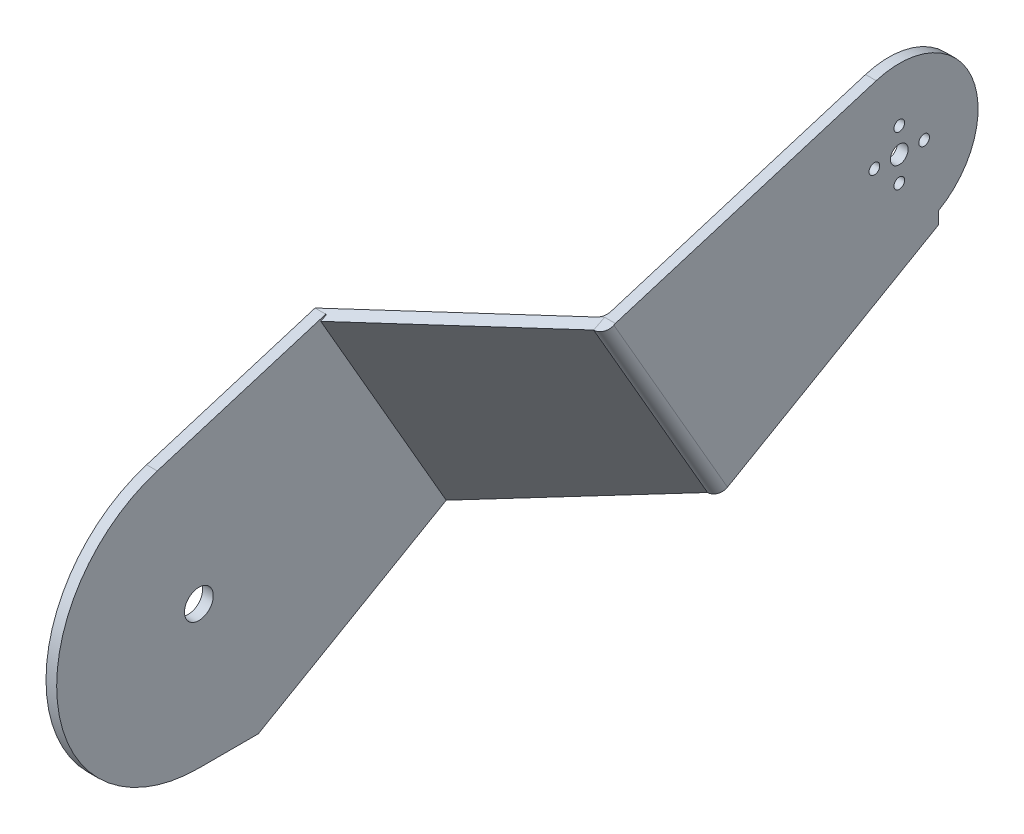
ISO-10303-21;
HEADER;
FILE_DESCRIPTION(('STEP AP214'),'2;1');
FILE_NAME('part.step','',(''),(''),'','','');
FILE_SCHEMA(('AUTOMOTIVE_DESIGN { 1 0 10303 214 1 1 1 1 }'));
ENDSEC;
DATA;
#1=APPLICATION_CONTEXT('core data for automotive mechanical design processes');
#2=APPLICATION_PROTOCOL_DEFINITION('international standard','automotive_design',2000,#1);
#3=PRODUCT_CONTEXT('',#1,'mechanical');
#4=PRODUCT('Part','Part','',(#3));
#5=PRODUCT_RELATED_PRODUCT_CATEGORY('part','',(#4));
#6=PRODUCT_DEFINITION_FORMATION('','',#4);
#7=PRODUCT_DEFINITION_CONTEXT('part definition',#1,'design');
#8=PRODUCT_DEFINITION('design','',#6,#7);
#9=PRODUCT_DEFINITION_SHAPE('','',#8);
#10=(LENGTH_UNIT() NAMED_UNIT(*) SI_UNIT(.MILLI.,.METRE.));
#11=(NAMED_UNIT(*) PLANE_ANGLE_UNIT() SI_UNIT($,.RADIAN.));
#12=(NAMED_UNIT(*) SI_UNIT($,.STERADIAN.) SOLID_ANGLE_UNIT());
#13=UNCERTAINTY_MEASURE_WITH_UNIT(LENGTH_MEASURE(1.E-05),#10,'distance_accuracy_value','');
#14=(GEOMETRIC_REPRESENTATION_CONTEXT(3) GLOBAL_UNCERTAINTY_ASSIGNED_CONTEXT((#13)) GLOBAL_UNIT_ASSIGNED_CONTEXT((#10,
#11,#12)) REPRESENTATION_CONTEXT('',''));
#15=CARTESIAN_POINT('',(0.,0.,0.));
#16=DIRECTION('',(0.,0.,1.));
#17=DIRECTION('',(1.,0.,0.));
#18=AXIS2_PLACEMENT_3D('',#15,#16,#17);
#19=CARTESIAN_POINT('',(-52.001,61.7550857669214,-65.1381957355268));
#20=DIRECTION('',(0.,-0.893612931495519,-0.448838421555002));
#21=DIRECTION('',(0.,0.448838421555002,-0.893612931495519));
#22=AXIS2_PLACEMENT_3D('',#19,#20,#21);
#23=PLANE('',#22);
#24=DIRECTION('',(0.,0.448838421555002,-0.893612931495518));
#25=VECTOR('',#24,1.);
#26=CARTESIAN_POINT('',(0.,23.1880208405675,11.6467368658676));
#27=LINE('',#26,#25);
#28=CARTESIAN_POINT('',(0.,60.1976964158819,-62.0375180826629));
#29=VERTEX_POINT('',#28);
#30=CARTESIAN_POINT('',(0.,61.7550857669214,-65.1381957355268));
#31=VERTEX_POINT('',#30);
#32=EDGE_CURVE('E180',#29,#31,#27,.T.);
#33=ORIENTED_EDGE('',*,*,#32,.F.);
#34=CARTESIAN_POINT('',(0.,61.5464351574655,-64.7227836989898));
#35=DIRECTION('',(0.,-0.893612931495519,-0.448838421555002));
#36=DIRECTION('',(0.,0.448838421555002,-0.893612931495519));
#37=AXIS2_PLACEMENT_3D('',#34,#35,#36);
#38=ELLIPSE('',#37,3.00495384711238,3.);
#39=CARTESIAN_POINT('',(3.,61.5464351574655,-64.7227836989898));
#40=VERTEX_POINT('',#39);
#41=EDGE_CURVE('E282',#29,#40,#38,.F.);
#42=ORIENTED_EDGE('',*,*,#41,.T.);
#43=DIRECTION('',(0.,0.448838421555002,-0.893612931495519));
#44=VECTOR('',#43,1.);
#45=CARTESIAN_POINT('',(3.,61.7550857669214,-65.1381957355268));
#46=LINE('',#45,#44);
#47=CARTESIAN_POINT('',(3.,61.7550857669214,-65.1381957355268));
#48=VERTEX_POINT('',#47);
#49=EDGE_CURVE('E175',#40,#48,#46,.T.);
#50=ORIENTED_EDGE('',*,*,#49,.T.);
#51=DIRECTION('',(1.,0.,0.));
#52=VECTOR('',#51,1.);
#53=CARTESIAN_POINT('',(-52.001,61.7550857669214,-65.1381957355268));
#54=LINE('',#53,#52);
#55=EDGE_CURVE('E177',#31,#48,#54,.T.);
#56=ORIENTED_EDGE('',*,*,#55,.F.);
#57=EDGE_LOOP('',(#33,#42,#50,#56));
#58=FACE_BOUND('',#57,.T.);
#59=ADVANCED_FACE('F38',(#58),#23,.F.);
#60=CARTESIAN_POINT('',(-49.,52.7438861013477,-35.6797788730056));
#61=DIRECTION('',(0.,-0.499389083922256,0.866377829159593));
#62=DIRECTION('',(0.,-0.866377829159594,-0.499389083922256));
#63=AXIS2_PLACEMENT_3D('',#60,#61,#62);
#64=PLANE('',#63);
#65=DIRECTION('',(0.,0.866377829159594,0.499389083922256));
#66=VECTOR('',#65,1.);
#67=CARTESIAN_POINT('',(-49.,52.7438861013477,-35.6797788730056));
#68=LINE('',#67,#66);
#69=CARTESIAN_POINT('',(-49.,52.485068329611,-35.8289640963344));
#70=VERTEX_POINT('',#69);
#71=CARTESIAN_POINT('',(-49.,52.7438861013477,-35.6797788730056));
#72=VERTEX_POINT('',#71);
#73=EDGE_CURVE('E266',#70,#72,#68,.T.);
#74=ORIENTED_EDGE('',*,*,#73,.F.);
#75=DIRECTION('',(-0.995078632440276,0.0858480114503154,0.049483676003467));
#76=VECTOR('',#75,1.);
#77=CARTESIAN_POINT('',(1.65545982496252,48.114890583547,-38.3479794586058));
#78=LINE('',#77,#76);
#79=CARTESIAN_POINT('',(-52.,52.7438861013477,-35.6797788730056));
#80=VERTEX_POINT('',#79);
#81=EDGE_CURVE('E249',#70,#80,#78,.T.);
#82=ORIENTED_EDGE('',*,*,#81,.T.);
#83=DIRECTION('',(-1.,0.,0.));
#84=VECTOR('',#83,1.);
#85=CARTESIAN_POINT('',(-49.,52.7438861013477,-35.6797788730056));
#86=LINE('',#85,#84);
#87=EDGE_CURVE('E151',#72,#80,#86,.T.);
#88=ORIENTED_EDGE('',*,*,#87,.F.);
#89=EDGE_LOOP('',(#74,#82,#88));
#90=FACE_BOUND('',#89,.T.);
#91=ADVANCED_FACE('F312',(#90),#64,.F.);
#92=CARTESIAN_POINT('',(1.50000000000001,60.4576348677735,-62.8872801075434));
#93=DIRECTION('',(-0.0989266681662473,-0.889229515491612,-0.446636746253684));
#94=DIRECTION('',(0.,0.448838421555002,-0.893612931495518));
#95=AXIS2_PLACEMENT_3D('',#92,#93,#94);
#96=PLANE('',#95);
#97=ORIENTED_EDGE('',*,*,#81,.F.);
#98=DIRECTION('',(0.,0.448838421555002,-0.893612931495518));
#99=VECTOR('',#98,1.);
#100=CARTESIAN_POINT('',(-49.,64.9439500437089,-60.6339212413113));
#101=LINE('',#100,#99);
#102=CARTESIAN_POINT('',(-49.,51.7063736540913,-34.2786252699026));
#103=VERTEX_POINT('',#102);
#104=EDGE_CURVE('E150',#103,#70,#101,.T.);
#105=ORIENTED_EDGE('',*,*,#104,.F.);
#106=DIRECTION('',(-0.860356620434527,-0.149093178660264,0.487398922599812));
#107=VECTOR('',#106,1.);
#108=CARTESIAN_POINT('',(1.50000000000001,60.4576348677735,-62.8872801075434));
#109=LINE('',#108,#107);
#110=EDGE_CURVE('E146',#29,#103,#109,.T.);
#111=ORIENTED_EDGE('',*,*,#110,.F.);
#112=ORIENTED_EDGE('',*,*,#32,.T.);
#113=DIRECTION('',(-0.860356620434527,-0.149093178660264,0.487398922599812));
#114=VECTOR('',#113,1.);
#115=CARTESIAN_POINT('',(0.,61.7550857669214,-65.1381957355268));
#116=LINE('',#115,#114);
#117=CARTESIAN_POINT('',(-1.49999999999998,61.4951473150299,-64.2884337106464));
#118=VERTEX_POINT('',#117);
#119=EDGE_CURVE('E183',#31,#118,#116,.T.);
#120=ORIENTED_EDGE('',*,*,#119,.T.);
#121=EDGE_CURVE('E186',#118,#80,#116,.T.);
#122=ORIENTED_EDGE('',*,*,#121,.T.);
#123=EDGE_LOOP('',(#97,#105,#111,#112,#120,#122));
#124=FACE_BOUND('',#123,.T.);
#125=ADVANCED_FACE('F308',(#124),#96,.F.);
#126=CARTESIAN_POINT('',(-49.,38.2504262101395,11.7006365101509));
#127=DIRECTION('',(0.,-0.956260655253486,-0.292515912753773));
#128=DIRECTION('',(0.,0.292515912753773,-0.956260655253487));
#129=AXIS2_PLACEMENT_3D('',#126,#127,#128);
#130=PLANE('',#129);
#131=DIRECTION('',(0.,-0.292515912753773,0.956260655253486));
#132=VECTOR('',#131,1.);
#133=CARTESIAN_POINT('',(-52.,38.2504262101395,11.7006365101509));
#134=LINE('',#133,#132);
#135=CARTESIAN_POINT('',(-52.,38.2504262101395,11.7006365101509));
#136=VERTEX_POINT('',#135);
#137=EDGE_CURVE('E265',#80,#136,#134,.T.);
#138=ORIENTED_EDGE('',*,*,#137,.T.);
#139=DIRECTION('',(-1.,0.,0.));
#140=VECTOR('',#139,1.);
#141=CARTESIAN_POINT('',(-49.,38.2504262101395,11.7006365101509));
#142=LINE('',#141,#140);
#143=CARTESIAN_POINT('',(-49.,38.2504262101395,11.7006365101509));
#144=VERTEX_POINT('',#143);
#145=EDGE_CURVE('E268',#144,#136,#142,.T.);
#146=ORIENTED_EDGE('',*,*,#145,.F.);
#147=DIRECTION('',(0.,-0.292515912753773,0.956260655253486));
#148=VECTOR('',#147,1.);
#149=CARTESIAN_POINT('',(-49.,38.2504262101395,11.7006365101509));
#150=LINE('',#149,#148);
#151=EDGE_CURVE('E260',#72,#144,#150,.T.);
#152=ORIENTED_EDGE('',*,*,#151,.F.);
#153=ORIENTED_EDGE('',*,*,#87,.T.);
#154=EDGE_LOOP('',(#138,#146,#152,#153));
#155=FACE_BOUND('',#154,.T.);
#156=ADVANCED_FACE('F296',(#155),#130,.F.);
#157=CARTESIAN_POINT('',(-42.,0.,0.));
#158=DIRECTION('',(-1.,0.,0.));
#159=DIRECTION('',(0.,0.,1.));
#160=AXIS2_PLACEMENT_3D('',#157,#158,#159);
#161=CYLINDRICAL_SURFACE('',#160,4.05);
#162=CARTESIAN_POINT('',(-52.,0.,0.));
#163=DIRECTION('',(-1.,0.,0.));
#164=DIRECTION('',(0.,0.,1.));
#165=AXIS2_PLACEMENT_3D('',#162,#163,#164);
#166=CIRCLE('',#165,4.05);
#167=CARTESIAN_POINT('',(-52.,0.,4.05));
#168=VERTEX_POINT('',#167);
#169=EDGE_CURVE('E171',#168,#168,#166,.T.);
#170=ORIENTED_EDGE('',*,*,#169,.T.);
#171=EDGE_LOOP('',(#170));
#172=FACE_BOUND('',#171,.T.);
#173=CARTESIAN_POINT('',(-49.,0.,0.));
#174=DIRECTION('',(-1.,0.,0.));
#175=DIRECTION('',(0.,0.,1.));
#176=AXIS2_PLACEMENT_3D('',#173,#174,#175);
#177=CIRCLE('',#176,4.05);
#178=CARTESIAN_POINT('',(-49.,0.,4.05));
#179=VERTEX_POINT('',#178);
#180=EDGE_CURVE('E174',#179,#179,#177,.T.);
#181=ORIENTED_EDGE('',*,*,#180,.F.);
#182=EDGE_LOOP('',(#181));
#183=FACE_BOUND('',#182,.T.);
#184=ADVANCED_FACE('F293',(#172,#183),#161,.F.);
#185=CARTESIAN_POINT('',(3.,38.2504262101395,11.7006365101509));
#186=DIRECTION('',(0.,0.956260655253487,0.292515912753773));
#187=DIRECTION('',(0.,-0.292515912753773,0.956260655253487));
#188=AXIS2_PLACEMENT_3D('',#185,#186,#187);
#189=PLANE('',#188);
#190=ORIENTED_EDGE('',*,*,#55,.T.);
#191=DIRECTION('',(0.,0.292515912753773,-0.956260655253487));
#192=VECTOR('',#191,1.);
#193=CARTESIAN_POINT('',(3.,38.2504262101395,11.7006365101509));
#194=LINE('',#193,#192);
#195=CARTESIAN_POINT('',(3.,84.2006679089215,-138.51480928312));
#196=VERTEX_POINT('',#195);
#197=EDGE_CURVE('E191',#48,#196,#194,.T.);
#198=ORIENTED_EDGE('',*,*,#197,.T.);
#199=DIRECTION('',(-1.,0.,0.));
#200=VECTOR('',#199,1.);
#201=CARTESIAN_POINT('',(3.,84.2006679089215,-138.51480928312));
#202=LINE('',#201,#200);
#203=CARTESIAN_POINT('',(0.,84.2006679089215,-138.51480928312));
#204=VERTEX_POINT('',#203);
#205=EDGE_CURVE('E187',#196,#204,#202,.T.);
#206=ORIENTED_EDGE('',*,*,#205,.T.);
#207=DIRECTION('',(0.,0.292515912753773,-0.956260655253487));
#208=VECTOR('',#207,1.);
#209=CARTESIAN_POINT('',(0.,38.2504262101395,11.7006365101509));
#210=LINE('',#209,#208);
#211=CARTESIAN_POINT('',(0.,62.2749626707045,-66.8377197852876));
#212=VERTEX_POINT('',#211);
#213=EDGE_CURVE('E206',#212,#204,#210,.T.);
#214=ORIENTED_EDGE('',*,*,#213,.F.);
#215=CARTESIAN_POINT('',(-3.,62.2749626707045,-66.8377197852876));
#216=DIRECTION('',(0.,0.956260655253487,0.292515912753773));
#217=DIRECTION('',(0.,-0.292515912753773,0.956260655253487));
#218=AXIS2_PLACEMENT_3D('',#215,#216,#217);
#219=ELLIPSE('',#218,3.07830504862782,3.);
#220=EDGE_CURVE('E46',#118,#212,#219,.T.);
#221=ORIENTED_EDGE('',*,*,#220,.F.);
#222=ORIENTED_EDGE('',*,*,#119,.F.);
#223=EDGE_LOOP('',(#190,#198,#206,#214,#221,#222));
#224=FACE_BOUND('',#223,.T.);
#225=ADVANCED_FACE('F295',(#224),#189,.T.);
#226=CARTESIAN_POINT('',(3.,63.,-145.));
#227=DIRECTION('',(-1.,0.,0.));
#228=DIRECTION('',(0.,0.,1.));
#229=AXIS2_PLACEMENT_3D('',#226,#227,#228);
#230=CYLINDRICAL_SURFACE('',#229,2.5);
#231=CARTESIAN_POINT('',(3.,63.,-145.));
#232=DIRECTION('',(1.,0.,0.));
#233=DIRECTION('',(0.,0.,-1.));
#234=AXIS2_PLACEMENT_3D('',#231,#232,#233);
#235=CIRCLE('',#234,2.5);
#236=CARTESIAN_POINT('',(3.,63.,-147.5));
#237=VERTEX_POINT('',#236);
#238=EDGE_CURVE('E197',#237,#237,#235,.T.);
#239=ORIENTED_EDGE('',*,*,#238,.T.);
#240=EDGE_LOOP('',(#239));
#241=FACE_BOUND('',#240,.T.);
#242=CARTESIAN_POINT('',(0.,63.,-145.));
#243=DIRECTION('',(1.,0.,0.));
#244=DIRECTION('',(0.,0.,-1.));
#245=AXIS2_PLACEMENT_3D('',#242,#243,#244);
#246=CIRCLE('',#245,2.5);
#247=CARTESIAN_POINT('',(0.,63.,-147.5));
#248=VERTEX_POINT('',#247);
#249=EDGE_CURVE('E210',#248,#248,#246,.T.);
#250=ORIENTED_EDGE('',*,*,#249,.F.);
#251=EDGE_LOOP('',(#250));
#252=FACE_BOUND('',#251,.T.);
#253=ADVANCED_FACE('F304',(#241,#252),#230,.F.);
#254=CARTESIAN_POINT('',(3.,70.,-145.));
#255=DIRECTION('',(-1.,0.,0.));
#256=DIRECTION('',(0.,0.,1.));
#257=AXIS2_PLACEMENT_3D('',#254,#255,#256);
#258=CYLINDRICAL_SURFACE('',#257,1.5);
#259=CARTESIAN_POINT('',(3.,70.,-145.));
#260=DIRECTION('',(1.,0.,0.));
#261=DIRECTION('',(0.,0.,-1.));
#262=AXIS2_PLACEMENT_3D('',#259,#260,#261);
#263=CIRCLE('',#262,1.5);
#264=CARTESIAN_POINT('',(3.,70.,-146.5));
#265=VERTEX_POINT('',#264);
#266=EDGE_CURVE('E234',#265,#265,#263,.T.);
#267=ORIENTED_EDGE('',*,*,#266,.T.);
#268=EDGE_LOOP('',(#267));
#269=FACE_BOUND('',#268,.T.);
#270=CARTESIAN_POINT('',(0.,70.,-145.));
#271=DIRECTION('',(1.,0.,0.));
#272=DIRECTION('',(0.,0.,-1.));
#273=AXIS2_PLACEMENT_3D('',#270,#271,#272);
#274=CIRCLE('',#273,1.5);
#275=CARTESIAN_POINT('',(0.,70.,-146.5));
#276=VERTEX_POINT('',#275);
#277=EDGE_CURVE('E215',#276,#276,#274,.T.);
#278=ORIENTED_EDGE('',*,*,#277,.F.);
#279=EDGE_LOOP('',(#278));
#280=FACE_BOUND('',#279,.T.);
#281=ADVANCED_FACE('F334',(#269,#280),#258,.F.);
#282=CARTESIAN_POINT('',(3.,63.,-152.));
#283=DIRECTION('',(-1.,0.,0.));
#284=DIRECTION('',(0.,0.,1.));
#285=AXIS2_PLACEMENT_3D('',#282,#283,#284);
#286=CYLINDRICAL_SURFACE('',#285,1.5);
#287=CARTESIAN_POINT('',(3.,63.,-152.));
#288=DIRECTION('',(1.,0.,0.));
#289=DIRECTION('',(0.,0.,-1.));
#290=AXIS2_PLACEMENT_3D('',#287,#288,#289);
#291=CIRCLE('',#290,1.5);
#292=CARTESIAN_POINT('',(3.,63.,-153.5));
#293=VERTEX_POINT('',#292);
#294=EDGE_CURVE('E237',#293,#293,#291,.T.);
#295=ORIENTED_EDGE('',*,*,#294,.T.);
#296=EDGE_LOOP('',(#295));
#297=FACE_BOUND('',#296,.T.);
#298=CARTESIAN_POINT('',(0.,63.,-152.));
#299=DIRECTION('',(1.,0.,0.));
#300=DIRECTION('',(0.,0.,-1.));
#301=AXIS2_PLACEMENT_3D('',#298,#299,#300);
#302=CIRCLE('',#301,1.5);
#303=CARTESIAN_POINT('',(0.,63.,-153.5));
#304=VERTEX_POINT('',#303);
#305=EDGE_CURVE('E218',#304,#304,#302,.T.);
#306=ORIENTED_EDGE('',*,*,#305,.F.);
#307=EDGE_LOOP('',(#306));
#308=FACE_BOUND('',#307,.T.);
#309=ADVANCED_FACE('F330',(#297,#308),#286,.F.);
#310=CARTESIAN_POINT('',(3.,56.,-145.));
#311=DIRECTION('',(-1.,0.,0.));
#312=DIRECTION('',(0.,0.,1.));
#313=AXIS2_PLACEMENT_3D('',#310,#311,#312);
#314=CYLINDRICAL_SURFACE('',#313,1.5);
#315=CARTESIAN_POINT('',(3.,56.,-145.));
#316=DIRECTION('',(1.,0.,0.));
#317=DIRECTION('',(0.,0.,-1.));
#318=AXIS2_PLACEMENT_3D('',#315,#316,#317);
#319=CIRCLE('',#318,1.5);
#320=CARTESIAN_POINT('',(3.,56.,-146.5));
#321=VERTEX_POINT('',#320);
#322=EDGE_CURVE('E240',#321,#321,#319,.T.);
#323=ORIENTED_EDGE('',*,*,#322,.T.);
#324=EDGE_LOOP('',(#323));
#325=FACE_BOUND('',#324,.T.);
#326=CARTESIAN_POINT('',(0.,56.,-145.));
#327=DIRECTION('',(1.,0.,0.));
#328=DIRECTION('',(0.,0.,-1.));
#329=AXIS2_PLACEMENT_3D('',#326,#327,#328);
#330=CIRCLE('',#329,1.5);
#331=CARTESIAN_POINT('',(0.,56.,-146.5));
#332=VERTEX_POINT('',#331);
#333=EDGE_CURVE('E221',#332,#332,#330,.T.);
#334=ORIENTED_EDGE('',*,*,#333,.F.);
#335=EDGE_LOOP('',(#334));
#336=FACE_BOUND('',#335,.T.);
#337=ADVANCED_FACE('F326',(#325,#336),#314,.F.);
#338=CARTESIAN_POINT('',(3.,62.9999999999999,-138.));
#339=DIRECTION('',(-1.,0.,0.));
#340=DIRECTION('',(0.,0.,1.));
#341=AXIS2_PLACEMENT_3D('',#338,#339,#340);
#342=CYLINDRICAL_SURFACE('',#341,1.50000000000003);
#343=CARTESIAN_POINT('',(3.,62.9999999999999,-138.));
#344=DIRECTION('',(1.,0.,0.));
#345=DIRECTION('',(0.,0.,-1.));
#346=AXIS2_PLACEMENT_3D('',#343,#344,#345);
#347=CIRCLE('',#346,1.50000000000003);
#348=CARTESIAN_POINT('',(3.,62.9999999999999,-139.5));
#349=VERTEX_POINT('',#348);
#350=EDGE_CURVE('E231',#349,#349,#347,.T.);
#351=ORIENTED_EDGE('',*,*,#350,.T.);
#352=EDGE_LOOP('',(#351));
#353=FACE_BOUND('',#352,.T.);
#354=CARTESIAN_POINT('',(0.,62.9999999999999,-138.));
#355=DIRECTION('',(1.,0.,0.));
#356=DIRECTION('',(0.,0.,-1.));
#357=AXIS2_PLACEMENT_3D('',#354,#355,#356);
#358=CIRCLE('',#357,1.50000000000003);
#359=CARTESIAN_POINT('',(0.,62.9999999999999,-139.5));
#360=VERTEX_POINT('',#359);
#361=EDGE_CURVE('E224',#360,#360,#358,.T.);
#362=ORIENTED_EDGE('',*,*,#361,.F.);
#363=EDGE_LOOP('',(#362));
#364=FACE_BOUND('',#363,.T.);
#365=ADVANCED_FACE('F322',(#353,#364),#342,.F.);
#366=CARTESIAN_POINT('',(-49.,0.,0.));
#367=DIRECTION('',(-1.,0.,0.));
#368=DIRECTION('',(0.,0.,1.));
#369=AXIS2_PLACEMENT_3D('',#366,#367,#368);
#370=CYLINDRICAL_SURFACE('',#369,40.);
#371=DIRECTION('',(1.,0.,0.));
#372=VECTOR('',#371,1.);
#373=CARTESIAN_POINT('',(-52.,-40.,0.));
#374=LINE('',#373,#372);
#375=CARTESIAN_POINT('',(-52.,-40.,0.));
#376=VERTEX_POINT('',#375);
#377=CARTESIAN_POINT('',(-49.,-40.,0.));
#378=VERTEX_POINT('',#377);
#379=EDGE_CURVE('E256',#376,#378,#374,.T.);
#380=ORIENTED_EDGE('',*,*,#379,.T.);
#381=CARTESIAN_POINT('',(-49.,0.,0.));
#382=DIRECTION('',(-1.,0.,0.));
#383=DIRECTION('',(0.,0.,1.));
#384=AXIS2_PLACEMENT_3D('',#381,#382,#383);
#385=CIRCLE('',#384,40.);
#386=EDGE_CURVE('E259',#378,#144,#385,.T.);
#387=ORIENTED_EDGE('',*,*,#386,.T.);
#388=ORIENTED_EDGE('',*,*,#145,.T.);
#389=CARTESIAN_POINT('',(-52.,0.,0.));
#390=DIRECTION('',(-1.,0.,0.));
#391=DIRECTION('',(0.,0.,1.));
#392=AXIS2_PLACEMENT_3D('',#389,#390,#391);
#393=CIRCLE('',#392,40.);
#394=EDGE_CURVE('E250',#376,#136,#393,.T.);
#395=ORIENTED_EDGE('',*,*,#394,.F.);
#396=EDGE_LOOP('',(#380,#387,#388,#395));
#397=FACE_BOUND('',#396,.T.);
#398=ADVANCED_FACE('F325',(#397),#370,.T.);
#399=CARTESIAN_POINT('',(-3.,44.4487022752963,-77.112959465945));
#400=DIRECTION('',(0.,0.866377829159594,0.499389083922255));
#401=DIRECTION('',(0.,-0.499389083922256,0.866377829159594));
#402=AXIS2_PLACEMENT_3D('',#399,#400,#401);
#403=CYLINDRICAL_SURFACE('',#402,3.);
#404=DIRECTION('',(0.,0.866377829159594,0.499389083922255));
#405=VECTOR('',#404,1.);
#406=CARTESIAN_POINT('',(0.,44.4487022752963,-77.112959465945));
#407=LINE('',#406,#405);
#408=CARTESIAN_POINT('',(0.,7.19445562143378,-98.586690074602));
#409=VERTEX_POINT('',#408);
#410=EDGE_CURVE('E284',#409,#212,#407,.T.);
#411=ORIENTED_EDGE('',*,*,#410,.F.);
#412=CARTESIAN_POINT('',(-3.,7.19445562143377,-98.586690074602));
#413=DIRECTION('',(0.,0.866377829159594,0.499389083922256));
#414=DIRECTION('',(0.,-0.499389083922256,0.866377829159594));
#415=AXIS2_PLACEMENT_3D('',#412,#413,#414);
#416=CIRCLE('',#415,3.);
#417=CARTESIAN_POINT('',(-1.49999999999997,5.89700472228585,-96.3357744466186));
#418=VERTEX_POINT('',#417);
#419=EDGE_CURVE('E60',#409,#418,#416,.F.);
#420=ORIENTED_EDGE('',*,*,#419,.T.);
#421=DIRECTION('',(0.,0.866377829159594,0.499389083922256));
#422=VECTOR('',#421,1.);
#423=CARTESIAN_POINT('',(-1.5,43.1512513761484,-74.8620438379616));
#424=LINE('',#423,#422);
#425=EDGE_CURVE('E287',#118,#418,#424,.F.);
#426=ORIENTED_EDGE('',*,*,#425,.F.);
#427=ORIENTED_EDGE('',*,*,#220,.T.);
#428=EDGE_LOOP('',(#411,#420,#426,#427));
#429=FACE_BOUND('',#428,.T.);
#430=ADVANCED_FACE('F40',(#429),#403,.F.);
#431=CARTESIAN_POINT('',(113.709204280833,76.3686481948789,-132.490087927577));
#432=DIRECTION('',(-0.500000000000004,0.432483633049311,-0.750305209327821));
#433=DIRECTION('',(0.832154434739251,0.,-0.554543953842973));
#434=AXIS2_PLACEMENT_3D('',#431,#432,#433);
#435=PLANE('',#434);
#436=ORIENTED_EDGE('',*,*,#121,.F.);
#437=ORIENTED_EDGE('',*,*,#425,.T.);
#438=DIRECTION('',(0.866025403784436,0.24969454196113,-0.4331889145798));
#439=VECTOR('',#438,1.);
#440=CARTESIAN_POINT('',(-52.,-8.66327759037451,-71.0754990659149));
#441=LINE('',#440,#439);
#442=CARTESIAN_POINT('',(-52.,-8.66327759037451,-71.0754990659149));
#443=VERTEX_POINT('',#442);
#444=EDGE_CURVE('E194',#443,#418,#441,.T.);
#445=ORIENTED_EDGE('',*,*,#444,.F.);
#446=DIRECTION('',(0.,-0.866377829159594,-0.499389083922256));
#447=VECTOR('',#446,1.);
#448=CARTESIAN_POINT('',(-52.,-8.66327759037451,-71.0754990659149));
#449=LINE('',#448,#447);
#450=EDGE_CURVE('E247',#80,#443,#449,.T.);
#451=ORIENTED_EDGE('',*,*,#450,.F.);
#452=EDGE_LOOP('',(#436,#437,#445,#451));
#453=FACE_BOUND('',#452,.T.);
#454=ADVANCED_FACE('F367',(#453),#435,.T.);
#455=CARTESIAN_POINT('',(-52.,-16.0519257813408,-52.2497752309563));
#456=DIRECTION('',(1.,0.,0.));
#457=DIRECTION('',(0.,0.,-1.));
#458=AXIS2_PLACEMENT_3D('',#455,#456,#457);
#459=PLANE('',#458);
#460=ORIENTED_EDGE('',*,*,#169,.F.);
#461=EDGE_LOOP('',(#460));
#462=FACE_BOUND('',#461,.T.);
#463=DIRECTION('',(0.,-0.499389083922256,0.866377829159594));
#464=VECTOR('',#463,1.);
#465=CARTESIAN_POINT('',(-52.,-18.6510592688196,-53.747942482723));
#466=LINE('',#465,#464);
#467=CARTESIAN_POINT('',(-52.,-40.,-16.7101907155731));
#468=VERTEX_POINT('',#467);
#469=EDGE_CURVE('E205',#443,#468,#466,.T.);
#470=ORIENTED_EDGE('',*,*,#469,.T.);
#471=DIRECTION('',(0.,0.,-1.));
#472=VECTOR('',#471,1.);
#473=CARTESIAN_POINT('',(-52.,-40.,0.));
#474=LINE('',#473,#472);
#475=EDGE_CURVE('E190',#376,#468,#474,.T.);
#476=ORIENTED_EDGE('',*,*,#475,.F.);
#477=ORIENTED_EDGE('',*,*,#394,.T.);
#478=ORIENTED_EDGE('',*,*,#137,.F.);
#479=ORIENTED_EDGE('',*,*,#450,.T.);
#480=EDGE_LOOP('',(#470,#476,#477,#478,#479));
#481=FACE_BOUND('',#480,.T.);
#482=ADVANCED_FACE('F370',(#462,#481),#459,.F.);
#483=CARTESIAN_POINT('',(-49.,0.,0.));
#484=DIRECTION('',(-1.,0.,0.));
#485=DIRECTION('',(0.,0.,-1.));
#486=AXIS2_PLACEMENT_3D('',#483,#484,#485);
#487=PLANE('',#486);
#488=ORIENTED_EDGE('',*,*,#386,.F.);
#489=DIRECTION('',(0.,0.,1.));
#490=VECTOR('',#489,1.);
#491=CARTESIAN_POINT('',(-49.,-40.,0.));
#492=LINE('',#491,#490);
#493=CARTESIAN_POINT('',(-49.,-40.,-16.7101907155731));
#494=VERTEX_POINT('',#493);
#495=EDGE_CURVE('E158',#494,#378,#492,.T.);
#496=ORIENTED_EDGE('',*,*,#495,.F.);
#497=DIRECTION('',(0.,0.499389083922256,-0.866377829159594));
#498=VECTOR('',#497,1.);
#499=CARTESIAN_POINT('',(-49.,-57.2298100107528,13.1813825577268));
#500=LINE('',#499,#498);
#501=CARTESIAN_POINT('',(-49.,-9.52824485647313,-69.5748886472592));
#502=VERTEX_POINT('',#501);
#503=EDGE_CURVE('E154',#494,#502,#500,.T.);
#504=ORIENTED_EDGE('',*,*,#503,.T.);
#505=DIRECTION('',(0.,0.866377829159594,0.499389083922255));
#506=VECTOR('',#505,1.);
#507=CARTESIAN_POINT('',(-49.,27.7260017973894,-48.1011580386023));
#508=LINE('',#507,#506);
#509=EDGE_CURVE('E139',#502,#103,#508,.T.);
#510=ORIENTED_EDGE('',*,*,#509,.T.);
#511=ORIENTED_EDGE('',*,*,#104,.T.);
#512=ORIENTED_EDGE('',*,*,#73,.T.);
#513=ORIENTED_EDGE('',*,*,#151,.T.);
#514=EDGE_LOOP('',(#488,#496,#504,#510,#511,#512,#513));
#515=FACE_BOUND('',#514,.T.);
#516=ORIENTED_EDGE('',*,*,#180,.T.);
#517=EDGE_LOOP('',(#516));
#518=FACE_BOUND('',#517,.T.);
#519=ADVANCED_FACE('F156',(#515,#518),#487,.F.);
#520=CARTESIAN_POINT('',(115.209204280833,75.0711972957309,-130.239172299594));
#521=DIRECTION('',(-0.500000000000004,0.432483633049311,-0.750305209327821));
#522=DIRECTION('',(0.832154434739251,0.,-0.554543953842973));
#523=AXIS2_PLACEMENT_3D('',#520,#521,#522);
#524=PLANE('',#523);
#525=DIRECTION('',(0.,0.866377829159594,0.499389083922255));
#526=VECTOR('',#525,1.);
#527=CARTESIAN_POINT('',(0.,41.8538004770004,-72.6111282099781));
#528=LINE('',#527,#526);
#529=CARTESIAN_POINT('',(0.,4.59955382313788,-94.084858818635));
#530=VERTEX_POINT('',#529);
#531=EDGE_CURVE('E181',#530,#29,#528,.T.);
#532=ORIENTED_EDGE('',*,*,#531,.T.);
#533=ORIENTED_EDGE('',*,*,#110,.T.);
#534=ORIENTED_EDGE('',*,*,#509,.F.);
#535=DIRECTION('',(0.866025403784436,0.24969454196113,-0.433188914579801));
#536=VECTOR('',#535,1.);
#537=CARTESIAN_POINT('',(-49.,-9.52824485647313,-69.5748886472592));
#538=LINE('',#537,#536);
#539=EDGE_CURVE('E143',#502,#530,#538,.T.);
#540=ORIENTED_EDGE('',*,*,#539,.T.);
#541=EDGE_LOOP('',(#532,#533,#534,#540));
#542=FACE_BOUND('',#541,.T.);
#543=ADVANCED_FACE('F141',(#542),#524,.F.);
#544=CARTESIAN_POINT('',(0.,8.69685456238343,-95.1858250543471));
#545=DIRECTION('',(0.,-0.866377829159594,-0.499389083922255));
#546=DIRECTION('',(0.,0.499389083922255,-0.866377829159594));
#547=AXIS2_PLACEMENT_3D('',#544,#545,#546);
#548=CYLINDRICAL_SURFACE('',#547,3.);
#549=CARTESIAN_POINT('',(0.,6.09772107490468,-96.6839923061139));
#550=DIRECTION('',(0.,0.866377829159594,0.499389083922256));
#551=DIRECTION('',(0.,0.499389083922256,-0.866377829159594));
#552=AXIS2_PLACEMENT_3D('',#549,#550,#551);
#553=CIRCLE('',#552,3.00000000000006);
#554=CARTESIAN_POINT('',(3.00000000000002,6.09772107490466,-96.6839923061139));
#555=VERTEX_POINT('',#554);
#556=EDGE_CURVE('E165',#530,#555,#553,.T.);
#557=ORIENTED_EDGE('',*,*,#556,.T.);
#558=DIRECTION('',(0.,0.866377829159594,0.499389083922255));
#559=VECTOR('',#558,1.);
#560=CARTESIAN_POINT('',(3.,8.69685456238343,-95.1858250543471));
#561=LINE('',#560,#559);
#562=EDGE_CURVE('E270',#40,#555,#561,.F.);
#563=ORIENTED_EDGE('',*,*,#562,.F.);
#564=ORIENTED_EDGE('',*,*,#41,.F.);
#565=ORIENTED_EDGE('',*,*,#531,.F.);
#566=EDGE_LOOP('',(#557,#563,#564,#565));
#567=FACE_BOUND('',#566,.T.);
#568=ADVANCED_FACE('F363',(#567),#548,.T.);
#569=CARTESIAN_POINT('',(3.,0.,0.));
#570=DIRECTION('',(1.,0.,0.));
#571=DIRECTION('',(0.,0.,-1.));
#572=AXIS2_PLACEMENT_3D('',#569,#570,#571);
#573=PLANE('',#572);
#574=CARTESIAN_POINT('',(3.,63.,-145.));
#575=DIRECTION('',(1.,0.,0.));
#576=DIRECTION('',(0.,0.,-1.));
#577=AXIS2_PLACEMENT_3D('',#574,#575,#576);
#578=CIRCLE('',#577,22.1703860683274);
#579=CARTESIAN_POINT('',(3.,43.7920690464924,-156.071648788865));
#580=VERTEX_POINT('',#579);
#581=EDGE_CURVE('E227',#580,#196,#578,.T.);
#582=ORIENTED_EDGE('',*,*,#581,.T.);
#583=ORIENTED_EDGE('',*,*,#197,.F.);
#584=ORIENTED_EDGE('',*,*,#49,.F.);
#585=ORIENTED_EDGE('',*,*,#562,.T.);
#586=DIRECTION('',(0.,0.499389083922256,-0.866377829159594));
#587=VECTOR('',#586,1.);
#588=CARTESIAN_POINT('',(3.,6.32948835533517,-97.0860796559464));
#589=LINE('',#588,#587);
#590=CARTESIAN_POINT('',(3.00000000000001,40.3293765594166,-156.071648788865));
#591=VERTEX_POINT('',#590);
#592=EDGE_CURVE('E52',#555,#591,#589,.T.);
#593=ORIENTED_EDGE('',*,*,#592,.T.);
#594=DIRECTION('',(0.,1.,0.));
#595=VECTOR('',#594,1.);
#596=CARTESIAN_POINT('',(3.,0.,-156.071648788865));
#597=LINE('',#596,#595);
#598=EDGE_CURVE('E11',#591,#580,#597,.T.);
#599=ORIENTED_EDGE('',*,*,#598,.T.);
#600=EDGE_LOOP('',(#582,#583,#584,#585,#593,#599));
#601=FACE_BOUND('',#600,.T.);
#602=ORIENTED_EDGE('',*,*,#350,.F.);
#603=EDGE_LOOP('',(#602));
#604=FACE_BOUND('',#603,.T.);
#605=ORIENTED_EDGE('',*,*,#322,.F.);
#606=EDGE_LOOP('',(#605));
#607=FACE_BOUND('',#606,.T.);
#608=ORIENTED_EDGE('',*,*,#294,.F.);
#609=EDGE_LOOP('',(#608));
#610=FACE_BOUND('',#609,.T.);
#611=ORIENTED_EDGE('',*,*,#266,.F.);
#612=EDGE_LOOP('',(#611));
#613=FACE_BOUND('',#612,.T.);
#614=ORIENTED_EDGE('',*,*,#238,.F.);
#615=EDGE_LOOP('',(#614));
#616=FACE_BOUND('',#615,.T.);
#617=ADVANCED_FACE('F345',(#601,#604,#607,#610,#613,#616),#573,.T.);
#618=CARTESIAN_POINT('',(3.,63.,-145.));
#619=DIRECTION('',(-1.,0.,0.));
#620=DIRECTION('',(0.,0.,1.));
#621=AXIS2_PLACEMENT_3D('',#618,#619,#620);
#622=CYLINDRICAL_SURFACE('',#621,22.1703860683274);
#623=CARTESIAN_POINT('',(0.,63.,-145.));
#624=DIRECTION('',(1.,0.,0.));
#625=DIRECTION('',(0.,0.,-1.));
#626=AXIS2_PLACEMENT_3D('',#623,#624,#625);
#627=CIRCLE('',#626,22.1703860683274);
#628=CARTESIAN_POINT('',(0.,43.7920690464924,-156.071648788865));
#629=VERTEX_POINT('',#628);
#630=EDGE_CURVE('E201',#629,#204,#627,.T.);
#631=ORIENTED_EDGE('',*,*,#630,.T.);
#632=ORIENTED_EDGE('',*,*,#205,.F.);
#633=ORIENTED_EDGE('',*,*,#581,.F.);
#634=DIRECTION('',(-1.,0.,0.));
#635=VECTOR('',#634,1.);
#636=CARTESIAN_POINT('',(3.,43.7920690464924,-156.071648788865));
#637=LINE('',#636,#635);
#638=EDGE_CURVE('E199',#580,#629,#637,.T.);
#639=ORIENTED_EDGE('',*,*,#638,.T.);
#640=EDGE_LOOP('',(#631,#632,#633,#639));
#641=FACE_BOUND('',#640,.T.);
#642=ADVANCED_FACE('F342',(#641),#622,.T.);
#643=CARTESIAN_POINT('',(0.,0.,0.));
#644=DIRECTION('',(1.,0.,0.));
#645=DIRECTION('',(0.,0.,-1.));
#646=AXIS2_PLACEMENT_3D('',#643,#644,#645);
#647=PLANE('',#646);
#648=ORIENTED_EDGE('',*,*,#361,.T.);
#649=EDGE_LOOP('',(#648));
#650=FACE_BOUND('',#649,.T.);
#651=ORIENTED_EDGE('',*,*,#333,.T.);
#652=EDGE_LOOP('',(#651));
#653=FACE_BOUND('',#652,.T.);
#654=ORIENTED_EDGE('',*,*,#305,.T.);
#655=EDGE_LOOP('',(#654));
#656=FACE_BOUND('',#655,.T.);
#657=ORIENTED_EDGE('',*,*,#277,.T.);
#658=EDGE_LOOP('',(#657));
#659=FACE_BOUND('',#658,.T.);
#660=ORIENTED_EDGE('',*,*,#249,.T.);
#661=EDGE_LOOP('',(#660));
#662=FACE_BOUND('',#661,.T.);
#663=DIRECTION('',(0.,0.499389083922256,-0.866377829159594));
#664=VECTOR('',#663,1.);
#665=CARTESIAN_POINT('',(0.,-37.2542466538625,-21.473730608657));
#666=LINE('',#665,#664);
#667=CARTESIAN_POINT('',(0.,40.3293765594166,-156.071648788865));
#668=VERTEX_POINT('',#667);
#669=EDGE_CURVE('E198',#409,#668,#666,.T.);
#670=ORIENTED_EDGE('',*,*,#669,.F.);
#671=ORIENTED_EDGE('',*,*,#410,.T.);
#672=ORIENTED_EDGE('',*,*,#213,.T.);
#673=ORIENTED_EDGE('',*,*,#630,.F.);
#674=DIRECTION('',(0.,-1.,0.));
#675=VECTOR('',#674,1.);
#676=CARTESIAN_POINT('',(0.,0.,-156.071648788865));
#677=LINE('',#676,#675);
#678=EDGE_CURVE('E202',#629,#668,#677,.T.);
#679=ORIENTED_EDGE('',*,*,#678,.T.);
#680=EDGE_LOOP('',(#670,#671,#672,#673,#679));
#681=FACE_BOUND('',#680,.T.);
#682=ADVANCED_FACE('F344',(#650,#653,#656,#659,#662,#681),#647,.F.);
#683=CARTESIAN_POINT('',(3.,0.,-156.071648788865));
#684=DIRECTION('',(0.,0.,-1.));
#685=DIRECTION('',(-1.,0.,0.));
#686=AXIS2_PLACEMENT_3D('',#683,#684,#685);
#687=PLANE('',#686);
#688=ORIENTED_EDGE('',*,*,#598,.F.);
#689=DIRECTION('',(-1.,0.,0.));
#690=VECTOR('',#689,1.);
#691=CARTESIAN_POINT('',(3.,40.3293765594166,-156.071648788865));
#692=LINE('',#691,#690);
#693=EDGE_CURVE('E195',#591,#668,#692,.T.);
#694=ORIENTED_EDGE('',*,*,#693,.T.);
#695=ORIENTED_EDGE('',*,*,#678,.F.);
#696=ORIENTED_EDGE('',*,*,#638,.F.);
#697=EDGE_LOOP('',(#688,#694,#695,#696));
#698=FACE_BOUND('',#697,.T.);
#699=ADVANCED_FACE('F354',(#698),#687,.T.);
#700=CARTESIAN_POINT('',(3.,-37.2542466538625,-21.473730608657));
#701=DIRECTION('',(0.,0.866377829159594,0.499389083922256));
#702=DIRECTION('',(0.,-0.499389083922256,0.866377829159594));
#703=AXIS2_PLACEMENT_3D('',#700,#701,#702);
#704=PLANE('',#703);
#705=ORIENTED_EDGE('',*,*,#693,.F.);
#706=ORIENTED_EDGE('',*,*,#592,.F.);
#707=ORIENTED_EDGE('',*,*,#556,.F.);
#708=ORIENTED_EDGE('',*,*,#539,.F.);
#709=ORIENTED_EDGE('',*,*,#503,.F.);
#710=DIRECTION('',(-1.,0.,0.));
#711=VECTOR('',#710,1.);
#712=CARTESIAN_POINT('',(3.,-40.,-16.7101907155731));
#713=LINE('',#712,#711);
#714=EDGE_CURVE('E192',#494,#468,#713,.T.);
#715=ORIENTED_EDGE('',*,*,#714,.T.);
#716=ORIENTED_EDGE('',*,*,#469,.F.);
#717=ORIENTED_EDGE('',*,*,#444,.T.);
#718=ORIENTED_EDGE('',*,*,#419,.F.);
#719=ORIENTED_EDGE('',*,*,#669,.T.);
#720=EDGE_LOOP('',(#705,#706,#707,#708,#709,#715,#716,#717,#718,#719));
#721=FACE_BOUND('',#720,.T.);
#722=ADVANCED_FACE('F163',(#721),#704,.F.);
#723=CARTESIAN_POINT('',(3.,-40.,0.));
#724=DIRECTION('',(0.,1.,0.));
#725=DIRECTION('',(0.,0.,1.));
#726=AXIS2_PLACEMENT_3D('',#723,#724,#725);
#727=PLANE('',#726);
#728=ORIENTED_EDGE('',*,*,#714,.F.);
#729=ORIENTED_EDGE('',*,*,#495,.T.);
#730=ORIENTED_EDGE('',*,*,#379,.F.);
#731=ORIENTED_EDGE('',*,*,#475,.T.);
#732=EDGE_LOOP('',(#728,#729,#730,#731));
#733=FACE_BOUND('',#732,.T.);
#734=ADVANCED_FACE('F348',(#733),#727,.F.);
#735=CLOSED_SHELL('',(#59,#91,#125,#156,#184,#225,#253,#281,#309,#337,#365,#398,#430,#454,#482,
#519,#543,#568,#617,#642,#682,#699,#722,#734));
#736=MANIFOLD_SOLID_BREP('B2',#735);
#737=ADVANCED_BREP_SHAPE_REPRESENTATION('',(#18,#736),#14);
#738=SHAPE_DEFINITION_REPRESENTATION(#9,#737);
ENDSEC;
END-ISO-10303-21;
